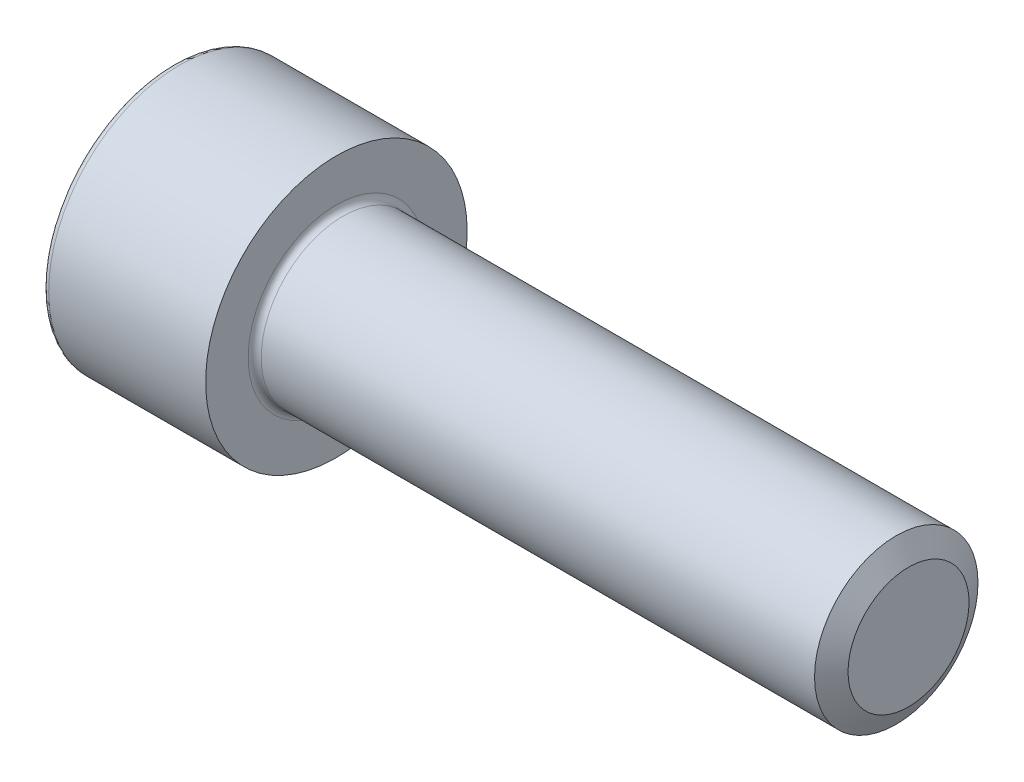
ISO-10303-21;
HEADER;
FILE_DESCRIPTION(('STEP AP214'),'2;1');
FILE_NAME('part.step','',(''),(''),'','','');
FILE_SCHEMA(('AUTOMOTIVE_DESIGN { 1 0 10303 214 1 1 1 1 }'));
ENDSEC;
DATA;
#1=APPLICATION_CONTEXT('core data for automotive mechanical design processes');
#2=APPLICATION_PROTOCOL_DEFINITION('international standard','automotive_design',2000,#1);
#3=PRODUCT_CONTEXT('',#1,'mechanical');
#4=PRODUCT('Part','Part','',(#3));
#5=PRODUCT_RELATED_PRODUCT_CATEGORY('part','',(#4));
#6=PRODUCT_DEFINITION_FORMATION('','',#4);
#7=PRODUCT_DEFINITION_CONTEXT('part definition',#1,'design');
#8=PRODUCT_DEFINITION('design','',#6,#7);
#9=PRODUCT_DEFINITION_SHAPE('','',#8);
#10=(LENGTH_UNIT() NAMED_UNIT(*) SI_UNIT(.MILLI.,.METRE.));
#11=(NAMED_UNIT(*) PLANE_ANGLE_UNIT() SI_UNIT($,.RADIAN.));
#12=(NAMED_UNIT(*) SI_UNIT($,.STERADIAN.) SOLID_ANGLE_UNIT());
#13=UNCERTAINTY_MEASURE_WITH_UNIT(LENGTH_MEASURE(1.E-05),#10,'distance_accuracy_value','');
#14=(GEOMETRIC_REPRESENTATION_CONTEXT(3) GLOBAL_UNCERTAINTY_ASSIGNED_CONTEXT((#13)) GLOBAL_UNIT_ASSIGNED_CONTEXT((#10,
#11,#12)) REPRESENTATION_CONTEXT('',''));
#15=CARTESIAN_POINT('',(0.,0.,0.));
#16=DIRECTION('',(0.,0.,1.));
#17=DIRECTION('',(1.,0.,0.));
#18=AXIS2_PLACEMENT_3D('',#15,#16,#17);
#19=CARTESIAN_POINT('',(0.,0.,0.));
#20=DIRECTION('',(1.,0.,0.));
#21=DIRECTION('',(0.,0.,-1.));
#22=AXIS2_PLACEMENT_3D('',#19,#20,#21);
#23=CYLINDRICAL_SURFACE('',#22,5.);
#24=CARTESIAN_POINT('',(10.4,0.,0.));
#25=DIRECTION('',(1.,0.,0.));
#26=DIRECTION('',(0.,0.,-1.));
#27=AXIS2_PLACEMENT_3D('',#24,#25,#26);
#28=CIRCLE('',#27,5.);
#29=CARTESIAN_POINT('',(10.4,0.,-5.));
#30=VERTEX_POINT('',#29);
#31=EDGE_CURVE('E143',#30,#30,#28,.T.);
#32=ORIENTED_EDGE('',*,*,#31,.T.);
#33=EDGE_LOOP('',(#32));
#34=FACE_BOUND('',#33,.T.);
#35=CARTESIAN_POINT('',(44.25,0.,0.));
#36=DIRECTION('',(-1.,0.,0.));
#37=DIRECTION('',(0.,0.,1.));
#38=AXIS2_PLACEMENT_3D('',#35,#36,#37);
#39=CIRCLE('',#38,5.);
#40=CARTESIAN_POINT('',(44.25,0.,5.));
#41=VERTEX_POINT('',#40);
#42=EDGE_CURVE('E313',#41,#41,#39,.T.);
#43=ORIENTED_EDGE('',*,*,#42,.T.);
#44=EDGE_LOOP('',(#43));
#45=FACE_BOUND('',#44,.T.);
#46=ADVANCED_FACE('F40',(#34,#45),#23,.T.);
#47=CARTESIAN_POINT('',(0.,0.,0.));
#48=DIRECTION('',(-1.,0.,0.));
#49=DIRECTION('',(0.,0.,1.));
#50=AXIS2_PLACEMENT_3D('',#47,#48,#49);
#51=PLANE('',#50);
#52=CARTESIAN_POINT('',(0.,0.,0.));
#53=DIRECTION('',(-1.,0.,0.));
#54=DIRECTION('',(0.,0.,1.));
#55=AXIS2_PLACEMENT_3D('',#52,#53,#54);
#56=CIRCLE('',#55,7.6);
#57=CARTESIAN_POINT('',(0.,0.,7.6));
#58=VERTEX_POINT('',#57);
#59=EDGE_CURVE('E11',#58,#58,#56,.T.);
#60=ORIENTED_EDGE('',*,*,#59,.T.);
#61=EDGE_LOOP('',(#60));
#62=FACE_BOUND('',#61,.T.);
#63=DIRECTION('',(0.,0.5,0.866025403784439));
#64=VECTOR('',#63,1.);
#65=CARTESIAN_POINT('',(0.,-4.575,0.));
#66=LINE('',#65,#64);
#67=CARTESIAN_POINT('',(0.,-4.575,0.));
#68=VERTEX_POINT('',#67);
#69=CARTESIAN_POINT('',(0.,-2.2875,3.96206622231381));
#70=VERTEX_POINT('',#69);
#71=EDGE_CURVE('E55',#68,#70,#66,.T.);
#72=ORIENTED_EDGE('',*,*,#71,.F.);
#73=DIRECTION('',(0.,-0.5,0.866025403784439));
#74=VECTOR('',#73,1.);
#75=CARTESIAN_POINT('',(0.,-2.2875,-3.96206622231381));
#76=LINE('',#75,#74);
#77=CARTESIAN_POINT('',(0.,-2.2875,-3.96206622231381));
#78=VERTEX_POINT('',#77);
#79=EDGE_CURVE('E139',#78,#68,#76,.T.);
#80=ORIENTED_EDGE('',*,*,#79,.F.);
#81=DIRECTION('',(0.,-1.,0.));
#82=VECTOR('',#81,1.);
#83=CARTESIAN_POINT('',(0.,2.2875,-3.96206622231381));
#84=LINE('',#83,#82);
#85=CARTESIAN_POINT('',(0.,2.2875,-3.96206622231381));
#86=VERTEX_POINT('',#85);
#87=EDGE_CURVE('E137',#86,#78,#84,.T.);
#88=ORIENTED_EDGE('',*,*,#87,.F.);
#89=DIRECTION('',(0.,-0.5,-0.866025403784439));
#90=VECTOR('',#89,1.);
#91=CARTESIAN_POINT('',(0.,4.575,0.));
#92=LINE('',#91,#90);
#93=CARTESIAN_POINT('',(0.,4.575,0.));
#94=VERTEX_POINT('',#93);
#95=EDGE_CURVE('E103',#94,#86,#92,.T.);
#96=ORIENTED_EDGE('',*,*,#95,.F.);
#97=DIRECTION('',(0.,0.5,-0.866025403784439));
#98=VECTOR('',#97,1.);
#99=CARTESIAN_POINT('',(0.,2.2875,3.9620662223138));
#100=LINE('',#99,#98);
#101=CARTESIAN_POINT('',(0.,2.2875,3.9620662223138));
#102=VERTEX_POINT('',#101);
#103=EDGE_CURVE('E133',#102,#94,#100,.T.);
#104=ORIENTED_EDGE('',*,*,#103,.F.);
#105=DIRECTION('',(0.,1.,0.));
#106=VECTOR('',#105,1.);
#107=CARTESIAN_POINT('',(0.,-2.2875,3.96206622231381));
#108=LINE('',#107,#106);
#109=EDGE_CURVE('E129',#70,#102,#108,.T.);
#110=ORIENTED_EDGE('',*,*,#109,.F.);
#111=EDGE_LOOP('',(#72,#80,#88,#96,#104,#110));
#112=FACE_BOUND('',#111,.T.);
#113=ADVANCED_FACE('F177',(#62,#112),#51,.T.);
#114=CARTESIAN_POINT('',(0.,0.,0.));
#115=DIRECTION('',(1.,0.,0.));
#116=DIRECTION('',(0.,0.,-1.));
#117=AXIS2_PLACEMENT_3D('',#114,#115,#116);
#118=CYLINDRICAL_SURFACE('',#117,8.);
#119=CARTESIAN_POINT('',(0.4,0.,0.));
#120=DIRECTION('',(-1.,0.,0.));
#121=DIRECTION('',(0.,0.,1.));
#122=AXIS2_PLACEMENT_3D('',#119,#120,#121);
#123=CIRCLE('',#122,8.);
#124=CARTESIAN_POINT('',(0.4,0.,8.));
#125=VERTEX_POINT('',#124);
#126=EDGE_CURVE('E48',#125,#125,#123,.F.);
#127=ORIENTED_EDGE('',*,*,#126,.T.);
#128=EDGE_LOOP('',(#127));
#129=FACE_BOUND('',#128,.T.);
#130=CARTESIAN_POINT('',(10.,0.,0.));
#131=DIRECTION('',(1.,0.,0.));
#132=DIRECTION('',(0.,0.,-1.));
#133=AXIS2_PLACEMENT_3D('',#130,#131,#132);
#134=CIRCLE('',#133,8.);
#135=CARTESIAN_POINT('',(10.,0.,-8.));
#136=VERTEX_POINT('',#135);
#137=EDGE_CURVE('E154',#136,#136,#134,.T.);
#138=ORIENTED_EDGE('',*,*,#137,.F.);
#139=EDGE_LOOP('',(#138));
#140=FACE_BOUND('',#139,.T.);
#141=ADVANCED_FACE('F160',(#129,#140),#118,.T.);
#142=CARTESIAN_POINT('',(10.,8.,0.));
#143=DIRECTION('',(1.,0.,0.));
#144=DIRECTION('',(0.,0.,-1.));
#145=AXIS2_PLACEMENT_3D('',#142,#143,#144);
#146=PLANE('',#145);
#147=ORIENTED_EDGE('',*,*,#137,.T.);
#148=EDGE_LOOP('',(#147));
#149=FACE_BOUND('',#148,.T.);
#150=CARTESIAN_POINT('',(10.,0.,0.));
#151=DIRECTION('',(1.,0.,0.));
#152=DIRECTION('',(0.,0.,-1.));
#153=AXIS2_PLACEMENT_3D('',#150,#151,#152);
#154=CIRCLE('',#153,5.4);
#155=CARTESIAN_POINT('',(10.,0.,-5.4));
#156=VERTEX_POINT('',#155);
#157=EDGE_CURVE('E151',#156,#156,#154,.T.);
#158=ORIENTED_EDGE('',*,*,#157,.F.);
#159=EDGE_LOOP('',(#158));
#160=FACE_BOUND('',#159,.T.);
#161=ADVANCED_FACE('F192',(#149,#160),#146,.T.);
#162=CARTESIAN_POINT('',(10.4,0.,0.));
#163=DIRECTION('',(1.,0.,0.));
#164=DIRECTION('',(0.,0.,-1.));
#165=AXIS2_PLACEMENT_3D('',#162,#163,#164);
#166=TOROIDAL_SURFACE('',#165,5.4,0.4);
#167=ORIENTED_EDGE('',*,*,#157,.T.);
#168=EDGE_LOOP('',(#167));
#169=FACE_BOUND('',#168,.T.);
#170=ORIENTED_EDGE('',*,*,#31,.F.);
#171=EDGE_LOOP('',(#170));
#172=FACE_BOUND('',#171,.T.);
#173=ADVANCED_FACE('F188',(#169,#172),#166,.F.);
#174=CARTESIAN_POINT('',(5.,-4.575,0.));
#175=DIRECTION('',(0.,-0.866025403784439,0.5));
#176=DIRECTION('',(0.,-0.5,-0.866025403784439));
#177=AXIS2_PLACEMENT_3D('',#174,#175,#176);
#178=PLANE('',#177);
#179=ORIENTED_EDGE('',*,*,#71,.T.);
#180=DIRECTION('',(-1.,0.,0.));
#181=VECTOR('',#180,1.);
#182=CARTESIAN_POINT('',(5.,-2.2875,3.96206622231381));
#183=LINE('',#182,#181);
#184=CARTESIAN_POINT('',(5.,-2.2875,3.96206622231381));
#185=VERTEX_POINT('',#184);
#186=EDGE_CURVE('E85',#185,#70,#183,.T.);
#187=ORIENTED_EDGE('',*,*,#186,.F.);
#188=DIRECTION('',(0.,0.5,0.866025403784439));
#189=VECTOR('',#188,1.);
#190=CARTESIAN_POINT('',(5.,-4.575,0.));
#191=LINE('',#190,#189);
#192=CARTESIAN_POINT('',(5.,-4.575,0.));
#193=VERTEX_POINT('',#192);
#194=EDGE_CURVE('E141',#193,#185,#191,.T.);
#195=ORIENTED_EDGE('',*,*,#194,.F.);
#196=DIRECTION('',(-1.,0.,0.));
#197=VECTOR('',#196,1.);
#198=CARTESIAN_POINT('',(5.,-4.575,0.));
#199=LINE('',#198,#197);
#200=EDGE_CURVE('E63',#193,#68,#199,.T.);
#201=ORIENTED_EDGE('',*,*,#200,.T.);
#202=EDGE_LOOP('',(#179,#187,#195,#201));
#203=FACE_BOUND('',#202,.T.);
#204=ADVANCED_FACE('F191',(#203),#178,.F.);
#205=CARTESIAN_POINT('',(5.,-2.2875,-3.96206622231381));
#206=DIRECTION('',(0.,-0.866025403784439,-0.5));
#207=DIRECTION('',(0.,0.5,-0.866025403784439));
#208=AXIS2_PLACEMENT_3D('',#205,#206,#207);
#209=PLANE('',#208);
#210=ORIENTED_EDGE('',*,*,#79,.T.);
#211=ORIENTED_EDGE('',*,*,#200,.F.);
#212=DIRECTION('',(0.,-0.5,0.866025403784439));
#213=VECTOR('',#212,1.);
#214=CARTESIAN_POINT('',(5.,-2.2875,-3.96206622231381));
#215=LINE('',#214,#213);
#216=CARTESIAN_POINT('',(5.,-2.2875,-3.96206622231381));
#217=VERTEX_POINT('',#216);
#218=EDGE_CURVE('E115',#217,#193,#215,.T.);
#219=ORIENTED_EDGE('',*,*,#218,.F.);
#220=DIRECTION('',(-1.,0.,0.));
#221=VECTOR('',#220,1.);
#222=CARTESIAN_POINT('',(5.,-2.2875,-3.96206622231381));
#223=LINE('',#222,#221);
#224=EDGE_CURVE('E107',#217,#78,#223,.T.);
#225=ORIENTED_EDGE('',*,*,#224,.T.);
#226=EDGE_LOOP('',(#210,#211,#219,#225));
#227=FACE_BOUND('',#226,.T.);
#228=ADVANCED_FACE('F217',(#227),#209,.F.);
#229=CARTESIAN_POINT('',(5.,2.2875,-3.96206622231381));
#230=DIRECTION('',(0.,0.,-1.));
#231=DIRECTION('',(0.,1.,0.));
#232=AXIS2_PLACEMENT_3D('',#229,#230,#231);
#233=PLANE('',#232);
#234=ORIENTED_EDGE('',*,*,#87,.T.);
#235=ORIENTED_EDGE('',*,*,#224,.F.);
#236=DIRECTION('',(0.,-1.,0.));
#237=VECTOR('',#236,1.);
#238=CARTESIAN_POINT('',(5.,2.2875,-3.96206622231381));
#239=LINE('',#238,#237);
#240=CARTESIAN_POINT('',(5.,2.2875,-3.96206622231381));
#241=VERTEX_POINT('',#240);
#242=EDGE_CURVE('E111',#241,#217,#239,.T.);
#243=ORIENTED_EDGE('',*,*,#242,.F.);
#244=DIRECTION('',(-1.,0.,0.));
#245=VECTOR('',#244,1.);
#246=CARTESIAN_POINT('',(5.,2.2875,-3.96206622231381));
#247=LINE('',#246,#245);
#248=EDGE_CURVE('E96',#241,#86,#247,.T.);
#249=ORIENTED_EDGE('',*,*,#248,.T.);
#250=EDGE_LOOP('',(#234,#235,#243,#249));
#251=FACE_BOUND('',#250,.T.);
#252=ADVANCED_FACE('F112',(#251),#233,.F.);
#253=CARTESIAN_POINT('',(5.,4.575,0.));
#254=DIRECTION('',(0.,0.866025403784439,-0.5));
#255=DIRECTION('',(0.,0.5,0.866025403784439));
#256=AXIS2_PLACEMENT_3D('',#253,#254,#255);
#257=PLANE('',#256);
#258=ORIENTED_EDGE('',*,*,#95,.T.);
#259=ORIENTED_EDGE('',*,*,#248,.F.);
#260=DIRECTION('',(0.,-0.5,-0.866025403784439));
#261=VECTOR('',#260,1.);
#262=CARTESIAN_POINT('',(5.,4.575,0.));
#263=LINE('',#262,#261);
#264=CARTESIAN_POINT('',(5.,4.575,0.));
#265=VERTEX_POINT('',#264);
#266=EDGE_CURVE('E100',#265,#241,#263,.T.);
#267=ORIENTED_EDGE('',*,*,#266,.F.);
#268=DIRECTION('',(-1.,0.,0.));
#269=VECTOR('',#268,1.);
#270=CARTESIAN_POINT('',(5.,4.575,0.));
#271=LINE('',#270,#269);
#272=EDGE_CURVE('E108',#265,#94,#271,.T.);
#273=ORIENTED_EDGE('',*,*,#272,.T.);
#274=EDGE_LOOP('',(#258,#259,#267,#273));
#275=FACE_BOUND('',#274,.T.);
#276=ADVANCED_FACE('F98',(#275),#257,.F.);
#277=CARTESIAN_POINT('',(5.,2.2875,3.9620662223138));
#278=DIRECTION('',(0.,0.866025403784439,0.5));
#279=DIRECTION('',(0.,-0.5,0.866025403784439));
#280=AXIS2_PLACEMENT_3D('',#277,#278,#279);
#281=PLANE('',#280);
#282=ORIENTED_EDGE('',*,*,#103,.T.);
#283=ORIENTED_EDGE('',*,*,#272,.F.);
#284=DIRECTION('',(0.,0.5,-0.866025403784439));
#285=VECTOR('',#284,1.);
#286=CARTESIAN_POINT('',(5.,2.2875,3.9620662223138));
#287=LINE('',#286,#285);
#288=CARTESIAN_POINT('',(5.,2.2875,3.9620662223138));
#289=VERTEX_POINT('',#288);
#290=EDGE_CURVE('E121',#289,#265,#287,.T.);
#291=ORIENTED_EDGE('',*,*,#290,.F.);
#292=DIRECTION('',(-1.,0.,0.));
#293=VECTOR('',#292,1.);
#294=CARTESIAN_POINT('',(5.,2.2875,3.9620662223138));
#295=LINE('',#294,#293);
#296=EDGE_CURVE('E146',#289,#102,#295,.T.);
#297=ORIENTED_EDGE('',*,*,#296,.T.);
#298=EDGE_LOOP('',(#282,#283,#291,#297));
#299=FACE_BOUND('',#298,.T.);
#300=ADVANCED_FACE('F235',(#299),#281,.F.);
#301=CARTESIAN_POINT('',(5.,-2.2875,3.96206622231381));
#302=DIRECTION('',(0.,0.,1.));
#303=DIRECTION('',(0.,-1.,0.));
#304=AXIS2_PLACEMENT_3D('',#301,#302,#303);
#305=PLANE('',#304);
#306=ORIENTED_EDGE('',*,*,#109,.T.);
#307=ORIENTED_EDGE('',*,*,#296,.F.);
#308=DIRECTION('',(0.,1.,0.));
#309=VECTOR('',#308,1.);
#310=CARTESIAN_POINT('',(5.,-2.2875,3.96206622231381));
#311=LINE('',#310,#309);
#312=EDGE_CURVE('E123',#185,#289,#311,.T.);
#313=ORIENTED_EDGE('',*,*,#312,.F.);
#314=ORIENTED_EDGE('',*,*,#186,.T.);
#315=EDGE_LOOP('',(#306,#307,#313,#314));
#316=FACE_BOUND('',#315,.T.);
#317=ADVANCED_FACE('F173',(#316),#305,.F.);
#318=CARTESIAN_POINT('',(5.,-2.2875,3.96206622231381));
#319=DIRECTION('',(-1.,0.,0.));
#320=DIRECTION('',(0.,0.,1.));
#321=AXIS2_PLACEMENT_3D('',#318,#319,#320);
#322=PLANE('',#321);
#323=ORIENTED_EDGE('',*,*,#194,.T.);
#324=ORIENTED_EDGE('',*,*,#312,.T.);
#325=ORIENTED_EDGE('',*,*,#290,.T.);
#326=ORIENTED_EDGE('',*,*,#266,.T.);
#327=ORIENTED_EDGE('',*,*,#242,.T.);
#328=ORIENTED_EDGE('',*,*,#218,.T.);
#329=EDGE_LOOP('',(#323,#324,#325,#326,#327,#328));
#330=FACE_BOUND('',#329,.T.);
#331=ADVANCED_FACE('F118',(#330),#322,.T.);
#332=CARTESIAN_POINT('',(0.4,0.,0.));
#333=DIRECTION('',(-1.,0.,0.));
#334=DIRECTION('',(0.,0.,1.));
#335=AXIS2_PLACEMENT_3D('',#332,#333,#334);
#336=TOROIDAL_SURFACE('',#335,7.6,0.4);
#337=ORIENTED_EDGE('',*,*,#59,.F.);
#338=EDGE_LOOP('',(#337));
#339=FACE_BOUND('',#338,.T.);
#340=ORIENTED_EDGE('',*,*,#126,.F.);
#341=EDGE_LOOP('',(#340));
#342=FACE_BOUND('',#341,.T.);
#343=ADVANCED_FACE('F42',(#339,#342),#336,.T.);
#344=CARTESIAN_POINT('',(44.25,0.,0.));
#345=DIRECTION('',(-1.,0.,0.));
#346=DIRECTION('',(0.,0.,1.));
#347=AXIS2_PLACEMENT_3D('',#344,#345,#346);
#348=CONICAL_SURFACE('',#347,5.,1.04718484902493);
#349=CARTESIAN_POINT('',(45.,0.,0.));
#350=DIRECTION('',(-1.,0.,0.));
#351=DIRECTION('',(0.,0.,1.));
#352=AXIS2_PLACEMENT_3D('',#349,#350,#351);
#353=CIRCLE('',#352,3.701);
#354=CARTESIAN_POINT('',(45.,0.,3.701));
#355=VERTEX_POINT('',#354);
#356=EDGE_CURVE('E130',#355,#355,#353,.T.);
#357=ORIENTED_EDGE('',*,*,#356,.T.);
#358=EDGE_LOOP('',(#357));
#359=FACE_BOUND('',#358,.T.);
#360=ORIENTED_EDGE('',*,*,#42,.F.);
#361=EDGE_LOOP('',(#360));
#362=FACE_BOUND('',#361,.T.);
#363=ADVANCED_FACE('F164',(#359,#362),#348,.T.);
#364=CARTESIAN_POINT('',(45.,5.,0.));
#365=DIRECTION('',(1.,0.,0.));
#366=DIRECTION('',(0.,0.,-1.));
#367=AXIS2_PLACEMENT_3D('',#364,#365,#366);
#368=PLANE('',#367);
#369=ORIENTED_EDGE('',*,*,#356,.F.);
#370=EDGE_LOOP('',(#369));
#371=FACE_BOUND('',#370,.T.);
#372=ADVANCED_FACE('F170',(#371),#368,.T.);
#373=CLOSED_SHELL('',(#46,#113,#141,#161,#173,#204,#228,#252,#276,#300,#317,#331,#343,#363,#372));
#374=MANIFOLD_SOLID_BREP('B2',#373);
#375=ADVANCED_BREP_SHAPE_REPRESENTATION('',(#18,#374),#14);
#376=SHAPE_DEFINITION_REPRESENTATION(#9,#375);
ENDSEC;
END-ISO-10303-21;
